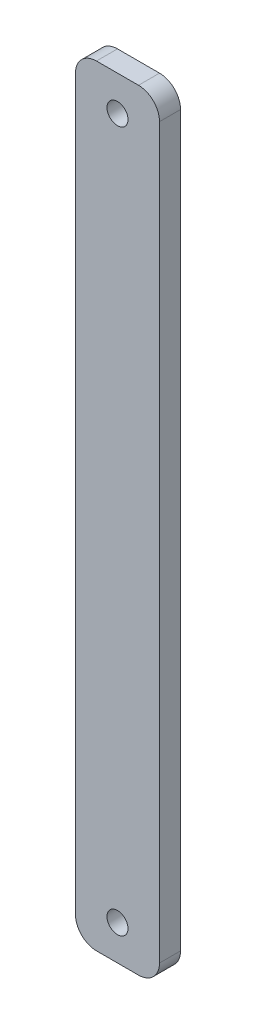
ISO-10303-21;
HEADER;
FILE_DESCRIPTION(('STEP AP214'),'2;1');
FILE_NAME('part.step','',(''),(''),'','','');
FILE_SCHEMA(('AUTOMOTIVE_DESIGN { 1 0 10303 214 1 1 1 1 }'));
ENDSEC;
DATA;
#1=APPLICATION_CONTEXT('core data for automotive mechanical design processes');
#2=APPLICATION_PROTOCOL_DEFINITION('international standard','automotive_design',2000,#1);
#3=PRODUCT_CONTEXT('',#1,'mechanical');
#4=PRODUCT('Part','Part','',(#3));
#5=PRODUCT_RELATED_PRODUCT_CATEGORY('part','',(#4));
#6=PRODUCT_DEFINITION_FORMATION('','',#4);
#7=PRODUCT_DEFINITION_CONTEXT('part definition',#1,'design');
#8=PRODUCT_DEFINITION('design','',#6,#7);
#9=PRODUCT_DEFINITION_SHAPE('','',#8);
#10=(LENGTH_UNIT() NAMED_UNIT(*) SI_UNIT(.MILLI.,.METRE.));
#11=(NAMED_UNIT(*) PLANE_ANGLE_UNIT() SI_UNIT($,.RADIAN.));
#12=(NAMED_UNIT(*) SI_UNIT($,.STERADIAN.) SOLID_ANGLE_UNIT());
#13=UNCERTAINTY_MEASURE_WITH_UNIT(LENGTH_MEASURE(1.E-05),#10,'distance_accuracy_value','');
#14=(GEOMETRIC_REPRESENTATION_CONTEXT(3) GLOBAL_UNCERTAINTY_ASSIGNED_CONTEXT((#13)) GLOBAL_UNIT_ASSIGNED_CONTEXT((#10,
#11,#12)) REPRESENTATION_CONTEXT('',''));
#15=CARTESIAN_POINT('',(0.,0.,0.));
#16=DIRECTION('',(0.,0.,1.));
#17=DIRECTION('',(1.,0.,0.));
#18=AXIS2_PLACEMENT_3D('',#15,#16,#17);
#19=CARTESIAN_POINT('',(3.,-52.,1.5));
#20=DIRECTION('',(0.,0.,1.));
#21=DIRECTION('',(1.,0.,0.));
#22=AXIS2_PLACEMENT_3D('',#19,#20,#21);
#23=PLANE('',#22);
#24=CARTESIAN_POINT('',(0.,50.,1.5));
#25=DIRECTION('',(0.,0.,1.));
#26=DIRECTION('',(1.,0.,0.));
#27=AXIS2_PLACEMENT_3D('',#24,#25,#26);
#28=CIRCLE('',#27,1.5);
#29=CARTESIAN_POINT('',(1.5,50.,1.5));
#30=VERTEX_POINT('',#29);
#31=EDGE_CURVE('E138',#30,#30,#28,.T.);
#32=ORIENTED_EDGE('',*,*,#31,.F.);
#33=EDGE_LOOP('',(#32));
#34=FACE_BOUND('',#33,.T.);
#35=CARTESIAN_POINT('',(3.,-52.,1.5));
#36=DIRECTION('',(0.,0.,1.));
#37=DIRECTION('',(1.,0.,0.));
#38=AXIS2_PLACEMENT_3D('',#35,#36,#37);
#39=CIRCLE('',#38,3.);
#40=CARTESIAN_POINT('',(3.,-55.,1.5));
#41=VERTEX_POINT('',#40);
#42=CARTESIAN_POINT('',(6.,-52.,1.5));
#43=VERTEX_POINT('',#42);
#44=EDGE_CURVE('E149',#41,#43,#39,.T.);
#45=ORIENTED_EDGE('',*,*,#44,.T.);
#46=DIRECTION('',(0.,1.,0.));
#47=VECTOR('',#46,1.);
#48=CARTESIAN_POINT('',(6.,-52.,1.5));
#49=LINE('',#48,#47);
#50=CARTESIAN_POINT('',(6.,52.,1.5));
#51=VERTEX_POINT('',#50);
#52=EDGE_CURVE('E97',#43,#51,#49,.T.);
#53=ORIENTED_EDGE('',*,*,#52,.T.);
#54=CARTESIAN_POINT('',(3.,52.,1.5));
#55=DIRECTION('',(0.,0.,1.));
#56=DIRECTION('',(-1.,0.,0.));
#57=AXIS2_PLACEMENT_3D('',#54,#55,#56);
#58=CIRCLE('',#57,3.);
#59=CARTESIAN_POINT('',(3.,55.,1.5));
#60=VERTEX_POINT('',#59);
#61=EDGE_CURVE('E164',#51,#60,#58,.T.);
#62=ORIENTED_EDGE('',*,*,#61,.T.);
#63=DIRECTION('',(-1.,0.,0.));
#64=VECTOR('',#63,1.);
#65=CARTESIAN_POINT('',(-3.,55.,1.5));
#66=LINE('',#65,#64);
#67=CARTESIAN_POINT('',(-3.,55.,1.5));
#68=VERTEX_POINT('',#67);
#69=EDGE_CURVE('E177',#60,#68,#66,.T.);
#70=ORIENTED_EDGE('',*,*,#69,.T.);
#71=CARTESIAN_POINT('',(-3.,52.,1.5));
#72=DIRECTION('',(0.,0.,1.));
#73=DIRECTION('',(-1.,0.,0.));
#74=AXIS2_PLACEMENT_3D('',#71,#72,#73);
#75=CIRCLE('',#74,3.);
#76=CARTESIAN_POINT('',(-6.,52.,1.5));
#77=VERTEX_POINT('',#76);
#78=EDGE_CURVE('E116',#68,#77,#75,.T.);
#79=ORIENTED_EDGE('',*,*,#78,.T.);
#80=DIRECTION('',(0.,-1.,0.));
#81=VECTOR('',#80,1.);
#82=CARTESIAN_POINT('',(-6.,-52.,1.5));
#83=LINE('',#82,#81);
#84=CARTESIAN_POINT('',(-6.,-52.,1.5));
#85=VERTEX_POINT('',#84);
#86=EDGE_CURVE('E110',#77,#85,#83,.T.);
#87=ORIENTED_EDGE('',*,*,#86,.T.);
#88=CARTESIAN_POINT('',(-3.,-52.,1.5));
#89=DIRECTION('',(0.,0.,1.));
#90=DIRECTION('',(-1.,0.,0.));
#91=AXIS2_PLACEMENT_3D('',#88,#89,#90);
#92=CIRCLE('',#91,3.);
#93=CARTESIAN_POINT('',(-3.,-55.,1.5));
#94=VERTEX_POINT('',#93);
#95=EDGE_CURVE('E114',#85,#94,#92,.T.);
#96=ORIENTED_EDGE('',*,*,#95,.T.);
#97=DIRECTION('',(1.,0.,0.));
#98=VECTOR('',#97,1.);
#99=CARTESIAN_POINT('',(-3.,-55.,1.5));
#100=LINE('',#99,#98);
#101=EDGE_CURVE('E54',#94,#41,#100,.T.);
#102=ORIENTED_EDGE('',*,*,#101,.T.);
#103=EDGE_LOOP('',(#45,#53,#62,#70,#79,#87,#96,#102));
#104=FACE_BOUND('',#103,.T.);
#105=CARTESIAN_POINT('',(0.,-50.,1.5));
#106=DIRECTION('',(0.,0.,1.));
#107=DIRECTION('',(-1.,0.,0.));
#108=AXIS2_PLACEMENT_3D('',#105,#106,#107);
#109=CIRCLE('',#108,1.5);
#110=CARTESIAN_POINT('',(-1.49999999999999,-50.,1.5));
#111=VERTEX_POINT('',#110);
#112=EDGE_CURVE('E186',#111,#111,#109,.T.);
#113=ORIENTED_EDGE('',*,*,#112,.F.);
#114=EDGE_LOOP('',(#113));
#115=FACE_BOUND('',#114,.T.);
#116=ADVANCED_FACE('F37',(#34,#104,#115),#23,.T.);
#117=CARTESIAN_POINT('',(3.,-52.,-1.5));
#118=DIRECTION('',(0.,0.,1.));
#119=DIRECTION('',(1.,0.,0.));
#120=AXIS2_PLACEMENT_3D('',#117,#118,#119);
#121=PLANE('',#120);
#122=CARTESIAN_POINT('',(3.,-52.,-1.5));
#123=DIRECTION('',(0.,0.,1.));
#124=DIRECTION('',(1.,0.,0.));
#125=AXIS2_PLACEMENT_3D('',#122,#123,#124);
#126=CIRCLE('',#125,3.);
#127=CARTESIAN_POINT('',(3.,-55.,-1.5));
#128=VERTEX_POINT('',#127);
#129=CARTESIAN_POINT('',(6.,-52.,-1.5));
#130=VERTEX_POINT('',#129);
#131=EDGE_CURVE('E134',#128,#130,#126,.T.);
#132=ORIENTED_EDGE('',*,*,#131,.F.);
#133=DIRECTION('',(1.,0.,0.));
#134=VECTOR('',#133,1.);
#135=CARTESIAN_POINT('',(-3.,-55.,-1.5));
#136=LINE('',#135,#134);
#137=CARTESIAN_POINT('',(-3.,-55.,-1.5));
#138=VERTEX_POINT('',#137);
#139=EDGE_CURVE('E89',#138,#128,#136,.T.);
#140=ORIENTED_EDGE('',*,*,#139,.F.);
#141=CARTESIAN_POINT('',(-3.,-52.,-1.5));
#142=DIRECTION('',(0.,0.,1.));
#143=DIRECTION('',(-1.,0.,0.));
#144=AXIS2_PLACEMENT_3D('',#141,#142,#143);
#145=CIRCLE('',#144,3.);
#146=CARTESIAN_POINT('',(-6.,-52.,-1.5));
#147=VERTEX_POINT('',#146);
#148=EDGE_CURVE('E83',#147,#138,#145,.T.);
#149=ORIENTED_EDGE('',*,*,#148,.F.);
#150=DIRECTION('',(0.,-1.,0.));
#151=VECTOR('',#150,1.);
#152=CARTESIAN_POINT('',(-6.,-52.,-1.5));
#153=LINE('',#152,#151);
#154=CARTESIAN_POINT('',(-6.,52.,-1.5));
#155=VERTEX_POINT('',#154);
#156=EDGE_CURVE('E124',#155,#147,#153,.T.);
#157=ORIENTED_EDGE('',*,*,#156,.F.);
#158=CARTESIAN_POINT('',(-3.,52.,-1.5));
#159=DIRECTION('',(0.,0.,1.));
#160=DIRECTION('',(-1.,0.,0.));
#161=AXIS2_PLACEMENT_3D('',#158,#159,#160);
#162=CIRCLE('',#161,3.);
#163=CARTESIAN_POINT('',(-3.,55.,-1.5));
#164=VERTEX_POINT('',#163);
#165=EDGE_CURVE('E144',#164,#155,#162,.T.);
#166=ORIENTED_EDGE('',*,*,#165,.F.);
#167=DIRECTION('',(-1.,0.,0.));
#168=VECTOR('',#167,1.);
#169=CARTESIAN_POINT('',(-3.,55.,-1.5));
#170=LINE('',#169,#168);
#171=CARTESIAN_POINT('',(3.,55.,-1.5));
#172=VERTEX_POINT('',#171);
#173=EDGE_CURVE('E142',#172,#164,#170,.T.);
#174=ORIENTED_EDGE('',*,*,#173,.F.);
#175=CARTESIAN_POINT('',(3.,52.,-1.5));
#176=DIRECTION('',(0.,0.,1.));
#177=DIRECTION('',(-1.,0.,0.));
#178=AXIS2_PLACEMENT_3D('',#175,#176,#177);
#179=CIRCLE('',#178,3.);
#180=CARTESIAN_POINT('',(6.,52.,-1.5));
#181=VERTEX_POINT('',#180);
#182=EDGE_CURVE('E140',#181,#172,#179,.T.);
#183=ORIENTED_EDGE('',*,*,#182,.F.);
#184=DIRECTION('',(0.,1.,0.));
#185=VECTOR('',#184,1.);
#186=CARTESIAN_POINT('',(6.,-52.,-1.5));
#187=LINE('',#186,#185);
#188=EDGE_CURVE('E137',#130,#181,#187,.T.);
#189=ORIENTED_EDGE('',*,*,#188,.F.);
#190=EDGE_LOOP('',(#132,#140,#149,#157,#166,#174,#183,#189));
#191=FACE_BOUND('',#190,.T.);
#192=CARTESIAN_POINT('',(0.,50.,-1.5));
#193=DIRECTION('',(0.,0.,1.));
#194=DIRECTION('',(1.,0.,0.));
#195=AXIS2_PLACEMENT_3D('',#192,#193,#194);
#196=CIRCLE('',#195,1.5);
#197=CARTESIAN_POINT('',(1.5,50.,-1.5));
#198=VERTEX_POINT('',#197);
#199=EDGE_CURVE('E183',#198,#198,#196,.T.);
#200=ORIENTED_EDGE('',*,*,#199,.T.);
#201=EDGE_LOOP('',(#200));
#202=FACE_BOUND('',#201,.T.);
#203=CARTESIAN_POINT('',(0.,-50.,-1.5));
#204=DIRECTION('',(0.,0.,1.));
#205=DIRECTION('',(-1.,0.,0.));
#206=AXIS2_PLACEMENT_3D('',#203,#204,#205);
#207=CIRCLE('',#206,1.5);
#208=CARTESIAN_POINT('',(-1.49999999999999,-50.,-1.5));
#209=VERTEX_POINT('',#208);
#210=EDGE_CURVE('E189',#209,#209,#207,.T.);
#211=ORIENTED_EDGE('',*,*,#210,.T.);
#212=EDGE_LOOP('',(#211));
#213=FACE_BOUND('',#212,.T.);
#214=ADVANCED_FACE('F168',(#191,#202,#213),#121,.F.);
#215=CARTESIAN_POINT('',(3.,-52.,1.5));
#216=DIRECTION('',(0.,0.,-1.));
#217=DIRECTION('',(-1.,0.,0.));
#218=AXIS2_PLACEMENT_3D('',#215,#216,#217);
#219=CYLINDRICAL_SURFACE('',#218,3.);
#220=ORIENTED_EDGE('',*,*,#131,.T.);
#221=DIRECTION('',(0.,0.,-1.));
#222=VECTOR('',#221,1.);
#223=CARTESIAN_POINT('',(6.,-52.,1.5));
#224=LINE('',#223,#222);
#225=EDGE_CURVE('E11',#43,#130,#224,.T.);
#226=ORIENTED_EDGE('',*,*,#225,.F.);
#227=ORIENTED_EDGE('',*,*,#44,.F.);
#228=DIRECTION('',(0.,0.,-1.));
#229=VECTOR('',#228,1.);
#230=CARTESIAN_POINT('',(3.,-55.,1.5));
#231=LINE('',#230,#229);
#232=EDGE_CURVE('E130',#41,#128,#231,.T.);
#233=ORIENTED_EDGE('',*,*,#232,.T.);
#234=EDGE_LOOP('',(#220,#226,#227,#233));
#235=FACE_BOUND('',#234,.T.);
#236=ADVANCED_FACE('F39',(#235),#219,.T.);
#237=CARTESIAN_POINT('',(6.,-52.,1.5));
#238=DIRECTION('',(-1.,0.,0.));
#239=DIRECTION('',(0.,0.,1.));
#240=AXIS2_PLACEMENT_3D('',#237,#238,#239);
#241=PLANE('',#240);
#242=ORIENTED_EDGE('',*,*,#188,.T.);
#243=DIRECTION('',(0.,0.,-1.));
#244=VECTOR('',#243,1.);
#245=CARTESIAN_POINT('',(6.,52.,1.5));
#246=LINE('',#245,#244);
#247=EDGE_CURVE('E46',#51,#181,#246,.T.);
#248=ORIENTED_EDGE('',*,*,#247,.F.);
#249=ORIENTED_EDGE('',*,*,#52,.F.);
#250=ORIENTED_EDGE('',*,*,#225,.T.);
#251=EDGE_LOOP('',(#242,#248,#249,#250));
#252=FACE_BOUND('',#251,.T.);
#253=ADVANCED_FACE('F221',(#252),#241,.F.);
#254=CARTESIAN_POINT('',(3.,52.,1.5));
#255=DIRECTION('',(0.,0.,-1.));
#256=DIRECTION('',(-1.,0.,0.));
#257=AXIS2_PLACEMENT_3D('',#254,#255,#256);
#258=CYLINDRICAL_SURFACE('',#257,3.);
#259=ORIENTED_EDGE('',*,*,#182,.T.);
#260=DIRECTION('',(0.,0.,-1.));
#261=VECTOR('',#260,1.);
#262=CARTESIAN_POINT('',(3.,55.,1.5));
#263=LINE('',#262,#261);
#264=EDGE_CURVE('E156',#60,#172,#263,.T.);
#265=ORIENTED_EDGE('',*,*,#264,.F.);
#266=ORIENTED_EDGE('',*,*,#61,.F.);
#267=ORIENTED_EDGE('',*,*,#247,.T.);
#268=EDGE_LOOP('',(#259,#265,#266,#267));
#269=FACE_BOUND('',#268,.T.);
#270=ADVANCED_FACE('F162',(#269),#258,.T.);
#271=CARTESIAN_POINT('',(-3.,55.,1.5));
#272=DIRECTION('',(0.,-1.,0.));
#273=DIRECTION('',(0.,0.,-1.));
#274=AXIS2_PLACEMENT_3D('',#271,#272,#273);
#275=PLANE('',#274);
#276=ORIENTED_EDGE('',*,*,#173,.T.);
#277=DIRECTION('',(0.,0.,-1.));
#278=VECTOR('',#277,1.);
#279=CARTESIAN_POINT('',(-3.,55.,1.5));
#280=LINE('',#279,#278);
#281=EDGE_CURVE('E153',#68,#164,#280,.T.);
#282=ORIENTED_EDGE('',*,*,#281,.F.);
#283=ORIENTED_EDGE('',*,*,#69,.F.);
#284=ORIENTED_EDGE('',*,*,#264,.T.);
#285=EDGE_LOOP('',(#276,#282,#283,#284));
#286=FACE_BOUND('',#285,.T.);
#287=ADVANCED_FACE('F173',(#286),#275,.F.);
#288=CARTESIAN_POINT('',(-3.,52.,1.5));
#289=DIRECTION('',(0.,0.,-1.));
#290=DIRECTION('',(-1.,0.,0.));
#291=AXIS2_PLACEMENT_3D('',#288,#289,#290);
#292=CYLINDRICAL_SURFACE('',#291,3.);
#293=ORIENTED_EDGE('',*,*,#165,.T.);
#294=DIRECTION('',(0.,0.,-1.));
#295=VECTOR('',#294,1.);
#296=CARTESIAN_POINT('',(-6.,52.,1.5));
#297=LINE('',#296,#295);
#298=EDGE_CURVE('E125',#77,#155,#297,.T.);
#299=ORIENTED_EDGE('',*,*,#298,.F.);
#300=ORIENTED_EDGE('',*,*,#78,.F.);
#301=ORIENTED_EDGE('',*,*,#281,.T.);
#302=EDGE_LOOP('',(#293,#299,#300,#301));
#303=FACE_BOUND('',#302,.T.);
#304=ADVANCED_FACE('F176',(#303),#292,.T.);
#305=CARTESIAN_POINT('',(-6.,-52.,1.5));
#306=DIRECTION('',(1.,0.,0.));
#307=DIRECTION('',(0.,0.,-1.));
#308=AXIS2_PLACEMENT_3D('',#305,#306,#307);
#309=PLANE('',#308);
#310=ORIENTED_EDGE('',*,*,#156,.T.);
#311=DIRECTION('',(0.,0.,-1.));
#312=VECTOR('',#311,1.);
#313=CARTESIAN_POINT('',(-6.,-52.,1.5));
#314=LINE('',#313,#312);
#315=EDGE_CURVE('E121',#85,#147,#314,.T.);
#316=ORIENTED_EDGE('',*,*,#315,.F.);
#317=ORIENTED_EDGE('',*,*,#86,.F.);
#318=ORIENTED_EDGE('',*,*,#298,.T.);
#319=EDGE_LOOP('',(#310,#316,#317,#318));
#320=FACE_BOUND('',#319,.T.);
#321=ADVANCED_FACE('F122',(#320),#309,.F.);
#322=CARTESIAN_POINT('',(-3.,-52.,1.5));
#323=DIRECTION('',(0.,0.,-1.));
#324=DIRECTION('',(-1.,0.,0.));
#325=AXIS2_PLACEMENT_3D('',#322,#323,#324);
#326=CYLINDRICAL_SURFACE('',#325,3.);
#327=ORIENTED_EDGE('',*,*,#148,.T.);
#328=DIRECTION('',(0.,0.,-1.));
#329=VECTOR('',#328,1.);
#330=CARTESIAN_POINT('',(-3.,-55.,1.5));
#331=LINE('',#330,#329);
#332=EDGE_CURVE('E126',#94,#138,#331,.T.);
#333=ORIENTED_EDGE('',*,*,#332,.F.);
#334=ORIENTED_EDGE('',*,*,#95,.F.);
#335=ORIENTED_EDGE('',*,*,#315,.T.);
#336=EDGE_LOOP('',(#327,#333,#334,#335));
#337=FACE_BOUND('',#336,.T.);
#338=ADVANCED_FACE('F128',(#337),#326,.T.);
#339=CARTESIAN_POINT('',(-3.,-55.,1.5));
#340=DIRECTION('',(0.,1.,0.));
#341=DIRECTION('',(0.,0.,1.));
#342=AXIS2_PLACEMENT_3D('',#339,#340,#341);
#343=PLANE('',#342);
#344=ORIENTED_EDGE('',*,*,#139,.T.);
#345=ORIENTED_EDGE('',*,*,#232,.F.);
#346=ORIENTED_EDGE('',*,*,#101,.F.);
#347=ORIENTED_EDGE('',*,*,#332,.T.);
#348=EDGE_LOOP('',(#344,#345,#346,#347));
#349=FACE_BOUND('',#348,.T.);
#350=ADVANCED_FACE('F209',(#349),#343,.F.);
#351=CARTESIAN_POINT('',(0.,50.,1.5));
#352=DIRECTION('',(0.,0.,-1.));
#353=DIRECTION('',(-1.,0.,0.));
#354=AXIS2_PLACEMENT_3D('',#351,#352,#353);
#355=CYLINDRICAL_SURFACE('',#354,1.5);
#356=ORIENTED_EDGE('',*,*,#31,.T.);
#357=EDGE_LOOP('',(#356));
#358=FACE_BOUND('',#357,.T.);
#359=ORIENTED_EDGE('',*,*,#199,.F.);
#360=EDGE_LOOP('',(#359));
#361=FACE_BOUND('',#360,.T.);
#362=ADVANCED_FACE('F206',(#358,#361),#355,.F.);
#363=CARTESIAN_POINT('',(0.,-50.,1.5));
#364=DIRECTION('',(0.,0.,-1.));
#365=DIRECTION('',(-1.,0.,0.));
#366=AXIS2_PLACEMENT_3D('',#363,#364,#365);
#367=CYLINDRICAL_SURFACE('',#366,1.5);
#368=ORIENTED_EDGE('',*,*,#112,.T.);
#369=EDGE_LOOP('',(#368));
#370=FACE_BOUND('',#369,.T.);
#371=ORIENTED_EDGE('',*,*,#210,.F.);
#372=EDGE_LOOP('',(#371));
#373=FACE_BOUND('',#372,.T.);
#374=ADVANCED_FACE('F195',(#370,#373),#367,.F.);
#375=CLOSED_SHELL('',(#116,#214,#236,#253,#270,#287,#304,#321,#338,#350,#362,#374));
#376=MANIFOLD_SOLID_BREP('B2',#375);
#377=ADVANCED_BREP_SHAPE_REPRESENTATION('',(#18,#376),#14);
#378=SHAPE_DEFINITION_REPRESENTATION(#9,#377);
ENDSEC;
END-ISO-10303-21;
